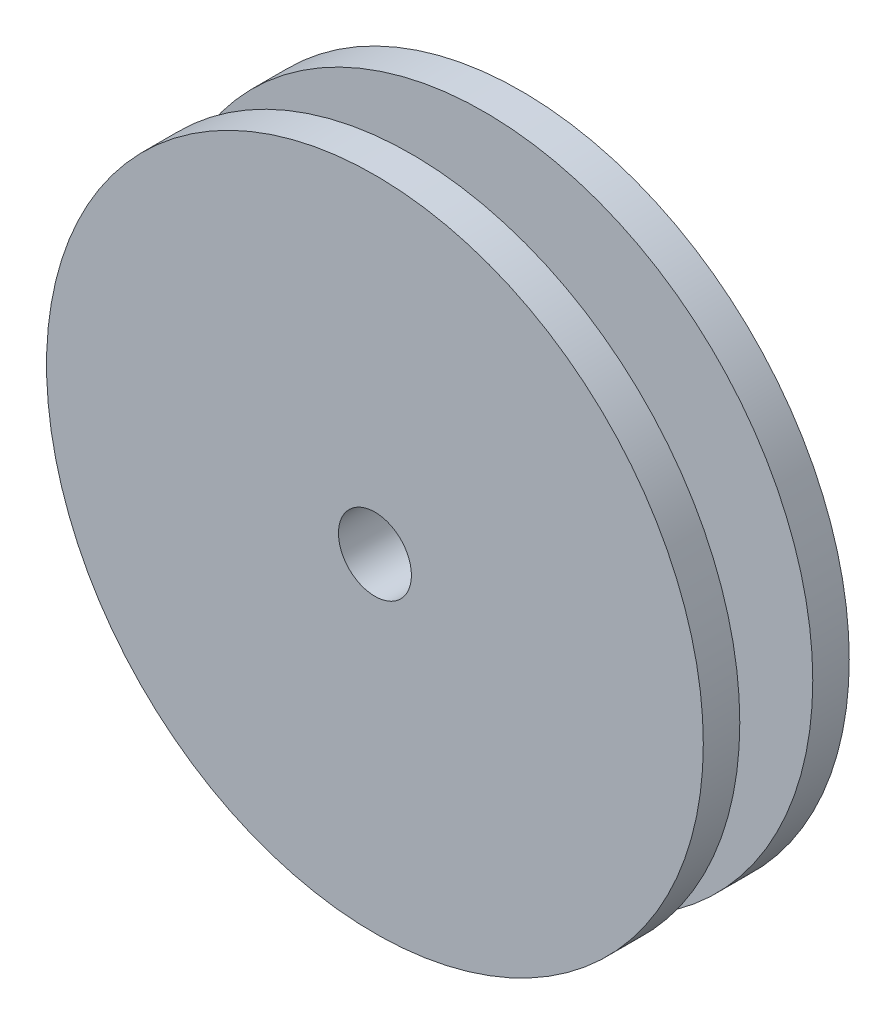
ISO-10303-21;
HEADER;
FILE_DESCRIPTION(('STEP AP214'),'2;1');
FILE_NAME('part.step','',(''),(''),'','','');
FILE_SCHEMA(('AUTOMOTIVE_DESIGN { 1 0 10303 214 1 1 1 1 }'));
ENDSEC;
DATA;
#1=APPLICATION_CONTEXT('core data for automotive mechanical design processes');
#2=APPLICATION_PROTOCOL_DEFINITION('international standard','automotive_design',2000,#1);
#3=PRODUCT_CONTEXT('',#1,'mechanical');
#4=PRODUCT('Part','Part','',(#3));
#5=PRODUCT_RELATED_PRODUCT_CATEGORY('part','',(#4));
#6=PRODUCT_DEFINITION_FORMATION('','',#4);
#7=PRODUCT_DEFINITION_CONTEXT('part definition',#1,'design');
#8=PRODUCT_DEFINITION('design','',#6,#7);
#9=PRODUCT_DEFINITION_SHAPE('','',#8);
#10=(LENGTH_UNIT() NAMED_UNIT(*) SI_UNIT(.MILLI.,.METRE.));
#11=(NAMED_UNIT(*) PLANE_ANGLE_UNIT() SI_UNIT($,.RADIAN.));
#12=(NAMED_UNIT(*) SI_UNIT($,.STERADIAN.) SOLID_ANGLE_UNIT());
#13=UNCERTAINTY_MEASURE_WITH_UNIT(LENGTH_MEASURE(1.E-05),#10,'distance_accuracy_value','');
#14=(GEOMETRIC_REPRESENTATION_CONTEXT(3) GLOBAL_UNCERTAINTY_ASSIGNED_CONTEXT((#13)) GLOBAL_UNIT_ASSIGNED_CONTEXT((#10,
#11,#12)) REPRESENTATION_CONTEXT('',''));
#15=CARTESIAN_POINT('',(0.,0.,0.));
#16=DIRECTION('',(0.,0.,1.));
#17=DIRECTION('',(1.,0.,0.));
#18=AXIS2_PLACEMENT_3D('',#15,#16,#17);
#19=CARTESIAN_POINT('',(0.,0.,6.));
#20=DIRECTION('',(0.,0.,-1.));
#21=DIRECTION('',(-1.,0.,0.));
#22=AXIS2_PLACEMENT_3D('',#19,#20,#21);
#23=CYLINDRICAL_SURFACE('',#22,13.5);
#24=CARTESIAN_POINT('',(0.,0.,0.));
#25=DIRECTION('',(0.,0.,1.));
#26=DIRECTION('',(1.,0.,0.));
#27=AXIS2_PLACEMENT_3D('',#24,#25,#26);
#28=CIRCLE('',#27,13.5);
#29=CARTESIAN_POINT('',(13.5,0.,0.));
#30=VERTEX_POINT('',#29);
#31=EDGE_CURVE('E35',#30,#30,#28,.T.);
#32=ORIENTED_EDGE('',*,*,#31,.T.);
#33=EDGE_LOOP('',(#32));
#34=FACE_BOUND('',#33,.T.);
#35=CARTESIAN_POINT('',(0.,0.,1.5));
#36=DIRECTION('',(0.,0.,1.));
#37=DIRECTION('',(1.,0.,0.));
#38=AXIS2_PLACEMENT_3D('',#35,#36,#37);
#39=CIRCLE('',#38,13.5);
#40=CARTESIAN_POINT('',(13.5,0.,1.5));
#41=VERTEX_POINT('',#40);
#42=EDGE_CURVE('E47',#41,#41,#39,.T.);
#43=ORIENTED_EDGE('',*,*,#42,.F.);
#44=EDGE_LOOP('',(#43));
#45=FACE_BOUND('',#44,.T.);
#46=ADVANCED_FACE('F31',(#34,#45),#23,.T.);
#47=CARTESIAN_POINT('',(0.,0.,4.5));
#48=DIRECTION('',(0.,0.,1.));
#49=DIRECTION('',(1.,0.,0.));
#50=AXIS2_PLACEMENT_3D('',#47,#48,#49);
#51=CIRCLE('',#50,13.5);
#52=CARTESIAN_POINT('',(13.5,0.,4.5));
#53=VERTEX_POINT('',#52);
#54=EDGE_CURVE('E50',#53,#53,#51,.T.);
#55=ORIENTED_EDGE('',*,*,#54,.T.);
#56=EDGE_LOOP('',(#55));
#57=FACE_BOUND('',#56,.T.);
#58=CARTESIAN_POINT('',(0.,0.,6.));
#59=DIRECTION('',(0.,0.,1.));
#60=DIRECTION('',(1.,0.,0.));
#61=AXIS2_PLACEMENT_3D('',#58,#59,#60);
#62=CIRCLE('',#61,13.5);
#63=CARTESIAN_POINT('',(13.5,0.,6.));
#64=VERTEX_POINT('',#63);
#65=EDGE_CURVE('E10',#64,#64,#62,.T.);
#66=ORIENTED_EDGE('',*,*,#65,.F.);
#67=EDGE_LOOP('',(#66));
#68=FACE_BOUND('',#67,.T.);
#69=ADVANCED_FACE('F33',(#57,#68),#23,.T.);
#70=CARTESIAN_POINT('',(0.,0.,6.));
#71=DIRECTION('',(0.,0.,1.));
#72=DIRECTION('',(1.,0.,0.));
#73=AXIS2_PLACEMENT_3D('',#70,#71,#72);
#74=PLANE('',#73);
#75=CARTESIAN_POINT('',(0.,0.,6.));
#76=DIRECTION('',(0.,0.,1.));
#77=DIRECTION('',(1.,0.,0.));
#78=AXIS2_PLACEMENT_3D('',#75,#76,#77);
#79=CIRCLE('',#78,1.5);
#80=CARTESIAN_POINT('',(1.5,0.,6.));
#81=VERTEX_POINT('',#80);
#82=EDGE_CURVE('E42',#81,#81,#79,.T.);
#83=ORIENTED_EDGE('',*,*,#82,.F.);
#84=EDGE_LOOP('',(#83));
#85=FACE_BOUND('',#84,.T.);
#86=ORIENTED_EDGE('',*,*,#65,.T.);
#87=EDGE_LOOP('',(#86));
#88=FACE_BOUND('',#87,.T.);
#89=ADVANCED_FACE('F78',(#85,#88),#74,.T.);
#90=CARTESIAN_POINT('',(0.,0.,0.));
#91=DIRECTION('',(0.,0.,1.));
#92=DIRECTION('',(1.,0.,0.));
#93=AXIS2_PLACEMENT_3D('',#90,#91,#92);
#94=PLANE('',#93);
#95=CARTESIAN_POINT('',(0.,0.,0.));
#96=DIRECTION('',(0.,0.,1.));
#97=DIRECTION('',(1.,0.,0.));
#98=AXIS2_PLACEMENT_3D('',#95,#96,#97);
#99=CIRCLE('',#98,1.5);
#100=CARTESIAN_POINT('',(1.5,0.,0.));
#101=VERTEX_POINT('',#100);
#102=EDGE_CURVE('E44',#101,#101,#99,.T.);
#103=ORIENTED_EDGE('',*,*,#102,.T.);
#104=EDGE_LOOP('',(#103));
#105=FACE_BOUND('',#104,.T.);
#106=ORIENTED_EDGE('',*,*,#31,.F.);
#107=EDGE_LOOP('',(#106));
#108=FACE_BOUND('',#107,.T.);
#109=ADVANCED_FACE('F82',(#105,#108),#94,.F.);
#110=CARTESIAN_POINT('',(0.,0.,6.));
#111=DIRECTION('',(0.,0.,-1.));
#112=DIRECTION('',(-1.,0.,0.));
#113=AXIS2_PLACEMENT_3D('',#110,#111,#112);
#114=CYLINDRICAL_SURFACE('',#113,1.5);
#115=ORIENTED_EDGE('',*,*,#82,.T.);
#116=EDGE_LOOP('',(#115));
#117=FACE_BOUND('',#116,.T.);
#118=ORIENTED_EDGE('',*,*,#102,.F.);
#119=EDGE_LOOP('',(#118));
#120=FACE_BOUND('',#119,.T.);
#121=ADVANCED_FACE('F69',(#117,#120),#114,.F.);
#122=CARTESIAN_POINT('',(0.,0.,1.5));
#123=DIRECTION('',(0.,0.,1.));
#124=DIRECTION('',(1.,0.,0.));
#125=AXIS2_PLACEMENT_3D('',#122,#123,#124);
#126=PLANE('',#125);
#127=CARTESIAN_POINT('',(0.,0.,1.5));
#128=DIRECTION('',(0.,0.,1.));
#129=DIRECTION('',(1.,0.,0.));
#130=AXIS2_PLACEMENT_3D('',#127,#128,#129);
#131=CIRCLE('',#130,9.);
#132=CARTESIAN_POINT('',(9.,0.,1.5));
#133=VERTEX_POINT('',#132);
#134=EDGE_CURVE('E53',#133,#133,#131,.T.);
#135=ORIENTED_EDGE('',*,*,#134,.F.);
#136=EDGE_LOOP('',(#135));
#137=FACE_BOUND('',#136,.T.);
#138=ORIENTED_EDGE('',*,*,#42,.T.);
#139=EDGE_LOOP('',(#138));
#140=FACE_BOUND('',#139,.T.);
#141=ADVANCED_FACE('F65',(#137,#140),#126,.T.);
#142=CARTESIAN_POINT('',(0.,0.,4.5));
#143=DIRECTION('',(0.,0.,1.));
#144=DIRECTION('',(1.,0.,0.));
#145=AXIS2_PLACEMENT_3D('',#142,#143,#144);
#146=PLANE('',#145);
#147=CARTESIAN_POINT('',(0.,0.,4.5));
#148=DIRECTION('',(0.,0.,1.));
#149=DIRECTION('',(1.,0.,0.));
#150=AXIS2_PLACEMENT_3D('',#147,#148,#149);
#151=CIRCLE('',#150,9.);
#152=CARTESIAN_POINT('',(9.,0.,4.5));
#153=VERTEX_POINT('',#152);
#154=EDGE_CURVE('E56',#153,#153,#151,.T.);
#155=ORIENTED_EDGE('',*,*,#154,.T.);
#156=EDGE_LOOP('',(#155));
#157=FACE_BOUND('',#156,.T.);
#158=ORIENTED_EDGE('',*,*,#54,.F.);
#159=EDGE_LOOP('',(#158));
#160=FACE_BOUND('',#159,.T.);
#161=ADVANCED_FACE('F68',(#157,#160),#146,.F.);
#162=CARTESIAN_POINT('',(0.,0.,1.5));
#163=DIRECTION('',(0.,0.,1.));
#164=DIRECTION('',(1.,0.,0.));
#165=AXIS2_PLACEMENT_3D('',#162,#163,#164);
#166=CYLINDRICAL_SURFACE('',#165,9.);
#167=ORIENTED_EDGE('',*,*,#134,.T.);
#168=EDGE_LOOP('',(#167));
#169=FACE_BOUND('',#168,.T.);
#170=ORIENTED_EDGE('',*,*,#154,.F.);
#171=EDGE_LOOP('',(#170));
#172=FACE_BOUND('',#171,.T.);
#173=ADVANCED_FACE('F62',(#169,#172),#166,.T.);
#174=CLOSED_SHELL('',(#46,#69,#89,#109,#121,#141,#161,#173));
#175=MANIFOLD_SOLID_BREP('B2',#174);
#176=ADVANCED_BREP_SHAPE_REPRESENTATION('',(#18,#175),#14);
#177=SHAPE_DEFINITION_REPRESENTATION(#9,#176);
ENDSEC;
END-ISO-10303-21;
